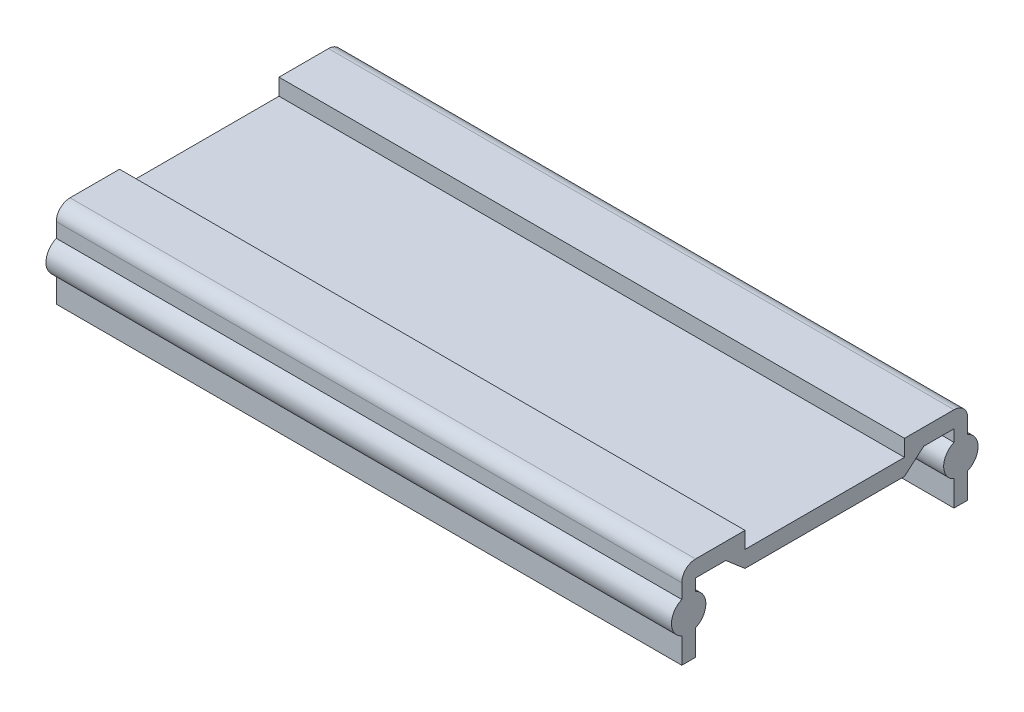
ISO-10303-21;
HEADER;
FILE_DESCRIPTION(('STEP AP214'),'2;1');
FILE_NAME('part.step','',(''),(''),'','','');
FILE_SCHEMA(('AUTOMOTIVE_DESIGN { 1 0 10303 214 1 1 1 1 }'));
ENDSEC;
DATA;
#1=APPLICATION_CONTEXT('core data for automotive mechanical design processes');
#2=APPLICATION_PROTOCOL_DEFINITION('international standard','automotive_design',2000,#1);
#3=PRODUCT_CONTEXT('',#1,'mechanical');
#4=PRODUCT('Part','Part','',(#3));
#5=PRODUCT_RELATED_PRODUCT_CATEGORY('part','',(#4));
#6=PRODUCT_DEFINITION_FORMATION('','',#4);
#7=PRODUCT_DEFINITION_CONTEXT('part definition',#1,'design');
#8=PRODUCT_DEFINITION('design','',#6,#7);
#9=PRODUCT_DEFINITION_SHAPE('','',#8);
#10=(LENGTH_UNIT() NAMED_UNIT(*) SI_UNIT(.MILLI.,.METRE.));
#11=(NAMED_UNIT(*) PLANE_ANGLE_UNIT() SI_UNIT($,.RADIAN.));
#12=(NAMED_UNIT(*) SI_UNIT($,.STERADIAN.) SOLID_ANGLE_UNIT());
#13=UNCERTAINTY_MEASURE_WITH_UNIT(LENGTH_MEASURE(1.E-05),#10,'distance_accuracy_value','');
#14=(GEOMETRIC_REPRESENTATION_CONTEXT(3) GLOBAL_UNCERTAINTY_ASSIGNED_CONTEXT((#13)) GLOBAL_UNIT_ASSIGNED_CONTEXT((#10,
#11,#12)) REPRESENTATION_CONTEXT('',''));
#15=CARTESIAN_POINT('',(0.,0.,0.));
#16=DIRECTION('',(0.,0.,1.));
#17=DIRECTION('',(1.,0.,0.));
#18=AXIS2_PLACEMENT_3D('',#15,#16,#17);
#19=CARTESIAN_POINT('',(45.5,2.2,10.4));
#20=DIRECTION('',(0.,0.,-1.));
#21=DIRECTION('',(-1.,0.,0.));
#22=AXIS2_PLACEMENT_3D('',#19,#20,#21);
#23=PLANE('',#22);
#24=DIRECTION('',(1.,0.,0.));
#25=VECTOR('',#24,1.);
#26=CARTESIAN_POINT('',(45.5,1.14564392373896,10.4));
#27=LINE('',#26,#25);
#28=CARTESIAN_POINT('',(45.5,1.14564392373896,10.4));
#29=VERTEX_POINT('',#28);
#30=CARTESIAN_POINT('',(0.,1.14564392373896,10.4));
#31=VERTEX_POINT('',#30);
#32=EDGE_CURVE('E218',#29,#31,#27,.F.);
#33=ORIENTED_EDGE('',*,*,#32,.F.);
#34=DIRECTION('',(0.,1.,0.));
#35=VECTOR('',#34,1.);
#36=CARTESIAN_POINT('',(45.5,2.2,10.4));
#37=LINE('',#36,#35);
#38=CARTESIAN_POINT('',(45.5,2.2,10.4));
#39=VERTEX_POINT('',#38);
#40=EDGE_CURVE('E314',#39,#29,#37,.F.);
#41=ORIENTED_EDGE('',*,*,#40,.F.);
#42=DIRECTION('',(1.,0.,0.));
#43=VECTOR('',#42,1.);
#44=CARTESIAN_POINT('',(45.5,2.2,10.4));
#45=LINE('',#44,#43);
#46=CARTESIAN_POINT('',(0.,2.2,10.4));
#47=VERTEX_POINT('',#46);
#48=EDGE_CURVE('E214',#47,#39,#45,.T.);
#49=ORIENTED_EDGE('',*,*,#48,.F.);
#50=DIRECTION('',(0.,1.,0.));
#51=VECTOR('',#50,1.);
#52=CARTESIAN_POINT('',(0.,2.2,10.4));
#53=LINE('',#52,#51);
#54=EDGE_CURVE('E310',#31,#47,#53,.T.);
#55=ORIENTED_EDGE('',*,*,#54,.F.);
#56=EDGE_LOOP('',(#33,#41,#49,#55));
#57=FACE_BOUND('',#56,.T.);
#58=ADVANCED_FACE('F17',(#57),#23,.F.);
#59=CARTESIAN_POINT('',(45.5,-3.,10.4));
#60=DIRECTION('',(0.,1.,0.));
#61=DIRECTION('',(0.,0.,1.));
#62=AXIS2_PLACEMENT_3D('',#59,#60,#61);
#63=PLANE('',#62);
#64=DIRECTION('',(1.,0.,0.));
#65=VECTOR('',#64,1.);
#66=CARTESIAN_POINT('',(45.5,-3.,9.4));
#67=LINE('',#66,#65);
#68=CARTESIAN_POINT('',(0.,-3.,9.4));
#69=VERTEX_POINT('',#68);
#70=CARTESIAN_POINT('',(45.5,-3.,9.4));
#71=VERTEX_POINT('',#70);
#72=EDGE_CURVE('E370',#69,#71,#67,.T.);
#73=ORIENTED_EDGE('',*,*,#72,.T.);
#74=DIRECTION('',(0.,0.,1.));
#75=VECTOR('',#74,1.);
#76=CARTESIAN_POINT('',(45.5,-3.,10.4));
#77=LINE('',#76,#75);
#78=CARTESIAN_POINT('',(45.5,-3.,10.4));
#79=VERTEX_POINT('',#78);
#80=EDGE_CURVE('E313',#79,#71,#77,.F.);
#81=ORIENTED_EDGE('',*,*,#80,.F.);
#82=DIRECTION('',(-1.,0.,0.));
#83=VECTOR('',#82,1.);
#84=CARTESIAN_POINT('',(45.5,-3.,10.4));
#85=LINE('',#84,#83);
#86=CARTESIAN_POINT('',(0.,-3.,10.4));
#87=VERTEX_POINT('',#86);
#88=EDGE_CURVE('E367',#79,#87,#85,.T.);
#89=ORIENTED_EDGE('',*,*,#88,.T.);
#90=DIRECTION('',(0.,0.,1.));
#91=VECTOR('',#90,1.);
#92=CARTESIAN_POINT('',(0.,-3.,10.4));
#93=LINE('',#92,#91);
#94=EDGE_CURVE('E319',#69,#87,#93,.T.);
#95=ORIENTED_EDGE('',*,*,#94,.F.);
#96=EDGE_LOOP('',(#73,#81,#89,#95));
#97=FACE_BOUND('',#96,.T.);
#98=ADVANCED_FACE('F505',(#97),#63,.F.);
#99=CARTESIAN_POINT('',(45.5,1.14564392373896,9.4));
#100=DIRECTION('',(0.,0.,1.));
#101=DIRECTION('',(1.,0.,0.));
#102=AXIS2_PLACEMENT_3D('',#99,#100,#101);
#103=PLANE('',#102);
#104=DIRECTION('',(1.,0.,0.));
#105=VECTOR('',#104,1.);
#106=CARTESIAN_POINT('',(45.5,2.,9.4));
#107=LINE('',#106,#105);
#108=CARTESIAN_POINT('',(0.,2.,9.4));
#109=VERTEX_POINT('',#108);
#110=CARTESIAN_POINT('',(45.5,2.,9.4));
#111=VERTEX_POINT('',#110);
#112=EDGE_CURVE('E266',#109,#111,#107,.T.);
#113=ORIENTED_EDGE('',*,*,#112,.T.);
#114=DIRECTION('',(0.,1.,0.));
#115=VECTOR('',#114,1.);
#116=CARTESIAN_POINT('',(45.5,1.14564392373896,9.4));
#117=LINE('',#116,#115);
#118=CARTESIAN_POINT('',(45.5,1.14564392373896,9.4));
#119=VERTEX_POINT('',#118);
#120=EDGE_CURVE('E323',#119,#111,#117,.T.);
#121=ORIENTED_EDGE('',*,*,#120,.F.);
#122=DIRECTION('',(1.,0.,0.));
#123=VECTOR('',#122,1.);
#124=CARTESIAN_POINT('',(45.5,1.14564392373896,9.4));
#125=LINE('',#124,#123);
#126=CARTESIAN_POINT('',(0.,1.14564392373896,9.4));
#127=VERTEX_POINT('',#126);
#128=EDGE_CURVE('E377',#127,#119,#125,.T.);
#129=ORIENTED_EDGE('',*,*,#128,.F.);
#130=DIRECTION('',(0.,1.,0.));
#131=VECTOR('',#130,1.);
#132=CARTESIAN_POINT('',(0.,1.14564392373896,9.4));
#133=LINE('',#132,#131);
#134=EDGE_CURVE('E327',#109,#127,#133,.F.);
#135=ORIENTED_EDGE('',*,*,#134,.F.);
#136=EDGE_LOOP('',(#113,#121,#129,#135));
#137=FACE_BOUND('',#136,.T.);
#138=ADVANCED_FACE('F493',(#137),#103,.F.);
#139=CARTESIAN_POINT('',(45.5,2.,-9.4));
#140=DIRECTION('',(0.,0.,-1.));
#141=DIRECTION('',(-1.,0.,0.));
#142=AXIS2_PLACEMENT_3D('',#139,#140,#141);
#143=PLANE('',#142);
#144=DIRECTION('',(1.,0.,0.));
#145=VECTOR('',#144,1.);
#146=CARTESIAN_POINT('',(45.5,1.14564392373896,-9.4));
#147=LINE('',#146,#145);
#148=CARTESIAN_POINT('',(45.5,1.14564392373896,-9.4));
#149=VERTEX_POINT('',#148);
#150=CARTESIAN_POINT('',(0.,1.14564392373896,-9.4));
#151=VERTEX_POINT('',#150);
#152=EDGE_CURVE('E282',#149,#151,#147,.F.);
#153=ORIENTED_EDGE('',*,*,#152,.F.);
#154=DIRECTION('',(0.,1.,0.));
#155=VECTOR('',#154,1.);
#156=CARTESIAN_POINT('',(45.5,2.,-9.4));
#157=LINE('',#156,#155);
#158=CARTESIAN_POINT('',(45.5,2.,-9.4));
#159=VERTEX_POINT('',#158);
#160=EDGE_CURVE('E331',#159,#149,#157,.F.);
#161=ORIENTED_EDGE('',*,*,#160,.F.);
#162=DIRECTION('',(1.,0.,0.));
#163=VECTOR('',#162,1.);
#164=CARTESIAN_POINT('',(45.5,2.,-9.4));
#165=LINE('',#164,#163);
#166=CARTESIAN_POINT('',(0.,2.,-9.4));
#167=VERTEX_POINT('',#166);
#168=EDGE_CURVE('E269',#159,#167,#165,.F.);
#169=ORIENTED_EDGE('',*,*,#168,.T.);
#170=DIRECTION('',(0.,1.,0.));
#171=VECTOR('',#170,1.);
#172=CARTESIAN_POINT('',(0.,2.,-9.4));
#173=LINE('',#172,#171);
#174=EDGE_CURVE('E334',#151,#167,#173,.T.);
#175=ORIENTED_EDGE('',*,*,#174,.F.);
#176=EDGE_LOOP('',(#153,#161,#169,#175));
#177=FACE_BOUND('',#176,.T.);
#178=ADVANCED_FACE('F561',(#177),#143,.F.);
#179=CARTESIAN_POINT('',(45.5,-3.,-9.4));
#180=DIRECTION('',(0.,1.,0.));
#181=DIRECTION('',(0.,0.,1.));
#182=AXIS2_PLACEMENT_3D('',#179,#180,#181);
#183=PLANE('',#182);
#184=DIRECTION('',(1.,0.,0.));
#185=VECTOR('',#184,1.);
#186=CARTESIAN_POINT('',(45.5,-3.,-10.4));
#187=LINE('',#186,#185);
#188=CARTESIAN_POINT('',(0.,-3.,-10.4));
#189=VERTEX_POINT('',#188);
#190=CARTESIAN_POINT('',(45.5,-3.,-10.4));
#191=VERTEX_POINT('',#190);
#192=EDGE_CURVE('E389',#189,#191,#187,.T.);
#193=ORIENTED_EDGE('',*,*,#192,.T.);
#194=DIRECTION('',(0.,0.,1.));
#195=VECTOR('',#194,1.);
#196=CARTESIAN_POINT('',(45.5,-3.,-9.4));
#197=LINE('',#196,#195);
#198=CARTESIAN_POINT('',(45.5,-3.,-9.4));
#199=VERTEX_POINT('',#198);
#200=EDGE_CURVE('E336',#199,#191,#197,.F.);
#201=ORIENTED_EDGE('',*,*,#200,.F.);
#202=DIRECTION('',(-1.,0.,0.));
#203=VECTOR('',#202,1.);
#204=CARTESIAN_POINT('',(45.5,-3.,-9.4));
#205=LINE('',#204,#203);
#206=CARTESIAN_POINT('',(0.,-3.,-9.4));
#207=VERTEX_POINT('',#206);
#208=EDGE_CURVE('E386',#199,#207,#205,.T.);
#209=ORIENTED_EDGE('',*,*,#208,.T.);
#210=DIRECTION('',(0.,0.,1.));
#211=VECTOR('',#210,1.);
#212=CARTESIAN_POINT('',(0.,-3.,-9.4));
#213=LINE('',#212,#211);
#214=EDGE_CURVE('E343',#189,#207,#213,.T.);
#215=ORIENTED_EDGE('',*,*,#214,.F.);
#216=EDGE_LOOP('',(#193,#201,#209,#215));
#217=FACE_BOUND('',#216,.T.);
#218=ADVANCED_FACE('F550',(#217),#183,.F.);
#219=CARTESIAN_POINT('',(45.5,1.14564392373896,-10.4));
#220=DIRECTION('',(0.,0.,1.));
#221=DIRECTION('',(1.,0.,0.));
#222=AXIS2_PLACEMENT_3D('',#219,#220,#221);
#223=PLANE('',#222);
#224=DIRECTION('',(1.,0.,0.));
#225=VECTOR('',#224,1.);
#226=CARTESIAN_POINT('',(45.5,2.2,-10.4));
#227=LINE('',#226,#225);
#228=CARTESIAN_POINT('',(45.5,2.2,-10.4));
#229=VERTEX_POINT('',#228);
#230=CARTESIAN_POINT('',(0.,2.2,-10.4));
#231=VERTEX_POINT('',#230);
#232=EDGE_CURVE('E190',#229,#231,#227,.F.);
#233=ORIENTED_EDGE('',*,*,#232,.F.);
#234=DIRECTION('',(0.,1.,0.));
#235=VECTOR('',#234,1.);
#236=CARTESIAN_POINT('',(45.5,1.14564392373896,-10.4));
#237=LINE('',#236,#235);
#238=CARTESIAN_POINT('',(45.5,1.14564392373896,-10.4));
#239=VERTEX_POINT('',#238);
#240=EDGE_CURVE('E196',#239,#229,#237,.T.);
#241=ORIENTED_EDGE('',*,*,#240,.F.);
#242=DIRECTION('',(1.,0.,0.));
#243=VECTOR('',#242,1.);
#244=CARTESIAN_POINT('',(45.5,1.14564392373896,-10.4));
#245=LINE('',#244,#243);
#246=CARTESIAN_POINT('',(0.,1.14564392373896,-10.4));
#247=VERTEX_POINT('',#246);
#248=EDGE_CURVE('E192',#247,#239,#245,.T.);
#249=ORIENTED_EDGE('',*,*,#248,.F.);
#250=DIRECTION('',(0.,1.,0.));
#251=VECTOR('',#250,1.);
#252=CARTESIAN_POINT('',(0.,1.14564392373896,-10.4));
#253=LINE('',#252,#251);
#254=EDGE_CURVE('E187',#231,#247,#253,.F.);
#255=ORIENTED_EDGE('',*,*,#254,.F.);
#256=EDGE_LOOP('',(#233,#241,#249,#255));
#257=FACE_BOUND('',#256,.T.);
#258=ADVANCED_FACE('F189',(#257),#223,.F.);
#259=CARTESIAN_POINT('',(45.5,2.2,-9.4));
#260=DIRECTION('',(1.,0.,0.));
#261=DIRECTION('',(0.,0.,-1.));
#262=AXIS2_PLACEMENT_3D('',#259,#260,#261);
#263=CYLINDRICAL_SURFACE('',#262,0.999999999999999);
#264=CARTESIAN_POINT('',(45.5,2.2,-9.4));
#265=DIRECTION('',(1.,0.,0.));
#266=DIRECTION('',(0.,0.,-1.));
#267=AXIS2_PLACEMENT_3D('',#264,#265,#266);
#268=CIRCLE('',#267,0.999999999999999);
#269=CARTESIAN_POINT('',(45.5,3.2,-9.4));
#270=VERTEX_POINT('',#269);
#271=EDGE_CURVE('E203',#270,#229,#268,.F.);
#272=ORIENTED_EDGE('',*,*,#271,.T.);
#273=ORIENTED_EDGE('',*,*,#232,.T.);
#274=CARTESIAN_POINT('',(0.,2.2,-9.4));
#275=DIRECTION('',(1.,0.,0.));
#276=DIRECTION('',(0.,0.,-1.));
#277=AXIS2_PLACEMENT_3D('',#274,#275,#276);
#278=CIRCLE('',#277,0.999999999999999);
#279=CARTESIAN_POINT('',(0.,3.2,-9.4));
#280=VERTEX_POINT('',#279);
#281=EDGE_CURVE('E20',#231,#280,#278,.T.);
#282=ORIENTED_EDGE('',*,*,#281,.T.);
#283=DIRECTION('',(1.,0.,0.));
#284=VECTOR('',#283,1.);
#285=CARTESIAN_POINT('',(45.5,3.2,-9.4));
#286=LINE('',#285,#284);
#287=EDGE_CURVE('E399',#280,#270,#286,.T.);
#288=ORIENTED_EDGE('',*,*,#287,.T.);
#289=EDGE_LOOP('',(#272,#273,#282,#288));
#290=FACE_BOUND('',#289,.T.);
#291=ADVANCED_FACE('F200',(#290),#263,.T.);
#292=CARTESIAN_POINT('',(45.5,3.2,-5.8));
#293=DIRECTION('',(0.,0.,-1.));
#294=DIRECTION('',(0.,1.,0.));
#295=AXIS2_PLACEMENT_3D('',#292,#293,#294);
#296=PLANE('',#295);
#297=DIRECTION('',(1.,0.,0.));
#298=VECTOR('',#297,1.);
#299=CARTESIAN_POINT('',(45.5,2.,-5.8));
#300=LINE('',#299,#298);
#301=CARTESIAN_POINT('',(0.,2.,-5.8));
#302=VERTEX_POINT('',#301);
#303=CARTESIAN_POINT('',(45.5,2.,-5.8));
#304=VERTEX_POINT('',#303);
#305=EDGE_CURVE('E286',#302,#304,#300,.T.);
#306=ORIENTED_EDGE('',*,*,#305,.T.);
#307=DIRECTION('',(0.,1.,0.));
#308=VECTOR('',#307,1.);
#309=CARTESIAN_POINT('',(45.5,3.2,-5.8));
#310=LINE('',#309,#308);
#311=CARTESIAN_POINT('',(45.5,3.2,-5.8));
#312=VERTEX_POINT('',#311);
#313=EDGE_CURVE('E205',#312,#304,#310,.F.);
#314=ORIENTED_EDGE('',*,*,#313,.F.);
#315=DIRECTION('',(1.,0.,0.));
#316=VECTOR('',#315,1.);
#317=CARTESIAN_POINT('',(45.5,3.2,-5.8));
#318=LINE('',#317,#316);
#319=CARTESIAN_POINT('',(0.,3.2,-5.8));
#320=VERTEX_POINT('',#319);
#321=EDGE_CURVE('E290',#312,#320,#318,.F.);
#322=ORIENTED_EDGE('',*,*,#321,.T.);
#323=DIRECTION('',(0.,1.,0.));
#324=VECTOR('',#323,1.);
#325=CARTESIAN_POINT('',(0.,3.2,-5.8));
#326=LINE('',#325,#324);
#327=EDGE_CURVE('E350',#302,#320,#326,.T.);
#328=ORIENTED_EDGE('',*,*,#327,.F.);
#329=EDGE_LOOP('',(#306,#314,#322,#328));
#330=FACE_BOUND('',#329,.T.);
#331=ADVANCED_FACE('F535',(#330),#296,.F.);
#332=CARTESIAN_POINT('',(45.5,2.,5.8));
#333=DIRECTION('',(0.,0.,1.));
#334=DIRECTION('',(0.,-1.,0.));
#335=AXIS2_PLACEMENT_3D('',#332,#333,#334);
#336=PLANE('',#335);
#337=DIRECTION('',(1.,0.,0.));
#338=VECTOR('',#337,1.);
#339=CARTESIAN_POINT('',(45.5,3.2,5.8));
#340=LINE('',#339,#338);
#341=CARTESIAN_POINT('',(0.,3.2,5.8));
#342=VERTEX_POINT('',#341);
#343=CARTESIAN_POINT('',(45.5,3.2,5.8));
#344=VERTEX_POINT('',#343);
#345=EDGE_CURVE('E307',#342,#344,#340,.T.);
#346=ORIENTED_EDGE('',*,*,#345,.T.);
#347=DIRECTION('',(0.,-1.,0.));
#348=VECTOR('',#347,1.);
#349=CARTESIAN_POINT('',(45.5,2.,5.8));
#350=LINE('',#349,#348);
#351=CARTESIAN_POINT('',(45.5,2.,5.8));
#352=VERTEX_POINT('',#351);
#353=EDGE_CURVE('E352',#352,#344,#350,.F.);
#354=ORIENTED_EDGE('',*,*,#353,.F.);
#355=DIRECTION('',(1.,0.,0.));
#356=VECTOR('',#355,1.);
#357=CARTESIAN_POINT('',(45.5,2.,5.8));
#358=LINE('',#357,#356);
#359=CARTESIAN_POINT('',(0.,2.,5.8));
#360=VERTEX_POINT('',#359);
#361=EDGE_CURVE('E289',#352,#360,#358,.F.);
#362=ORIENTED_EDGE('',*,*,#361,.T.);
#363=DIRECTION('',(0.,-1.,0.));
#364=VECTOR('',#363,1.);
#365=CARTESIAN_POINT('',(0.,2.,5.8));
#366=LINE('',#365,#364);
#367=EDGE_CURVE('E215',#342,#360,#366,.T.);
#368=ORIENTED_EDGE('',*,*,#367,.F.);
#369=EDGE_LOOP('',(#346,#354,#362,#368));
#370=FACE_BOUND('',#369,.T.);
#371=ADVANCED_FACE('F527',(#370),#336,.F.);
#372=CARTESIAN_POINT('',(45.5,2.2,9.4));
#373=DIRECTION('',(1.,0.,0.));
#374=DIRECTION('',(0.,0.,-1.));
#375=AXIS2_PLACEMENT_3D('',#372,#373,#374);
#376=CYLINDRICAL_SURFACE('',#375,0.999999999999999);
#377=CARTESIAN_POINT('',(45.5,2.2,9.4));
#378=DIRECTION('',(1.,0.,0.));
#379=DIRECTION('',(0.,0.,-1.));
#380=AXIS2_PLACEMENT_3D('',#377,#378,#379);
#381=CIRCLE('',#380,0.999999999999999);
#382=CARTESIAN_POINT('',(45.5,3.2,9.4));
#383=VERTEX_POINT('',#382);
#384=EDGE_CURVE('E216',#39,#383,#381,.F.);
#385=ORIENTED_EDGE('',*,*,#384,.T.);
#386=DIRECTION('',(1.,0.,0.));
#387=VECTOR('',#386,1.);
#388=CARTESIAN_POINT('',(45.5,3.2,9.4));
#389=LINE('',#388,#387);
#390=CARTESIAN_POINT('',(0.,3.2,9.4));
#391=VERTEX_POINT('',#390);
#392=EDGE_CURVE('E409',#383,#391,#389,.F.);
#393=ORIENTED_EDGE('',*,*,#392,.T.);
#394=CARTESIAN_POINT('',(0.,2.2,9.4));
#395=DIRECTION('',(1.,0.,0.));
#396=DIRECTION('',(0.,0.,-1.));
#397=AXIS2_PLACEMENT_3D('',#394,#395,#396);
#398=CIRCLE('',#397,0.999999999999999);
#399=EDGE_CURVE('E212',#391,#47,#398,.T.);
#400=ORIENTED_EDGE('',*,*,#399,.T.);
#401=ORIENTED_EDGE('',*,*,#48,.T.);
#402=EDGE_LOOP('',(#385,#393,#400,#401));
#403=FACE_BOUND('',#402,.T.);
#404=ADVANCED_FACE('F520',(#403),#376,.T.);
#405=CARTESIAN_POINT('',(45.5,0.,9.9));
#406=DIRECTION('',(1.,0.,0.));
#407=DIRECTION('',(0.,0.,-1.));
#408=AXIS2_PLACEMENT_3D('',#405,#406,#407);
#409=CYLINDRICAL_SURFACE('',#408,1.25);
#410=CARTESIAN_POINT('',(45.5,0.,9.9));
#411=DIRECTION('',(1.,0.,0.));
#412=DIRECTION('',(0.,0.,-1.));
#413=AXIS2_PLACEMENT_3D('',#410,#411,#412);
#414=CIRCLE('',#413,1.25);
#415=CARTESIAN_POINT('',(45.5,-1.14564392373896,10.4));
#416=VERTEX_POINT('',#415);
#417=EDGE_CURVE('E219',#29,#416,#414,.T.);
#418=ORIENTED_EDGE('',*,*,#417,.F.);
#419=ORIENTED_EDGE('',*,*,#32,.T.);
#420=CARTESIAN_POINT('',(0.,0.,9.9));
#421=DIRECTION('',(1.,0.,0.));
#422=DIRECTION('',(0.,0.,-1.));
#423=AXIS2_PLACEMENT_3D('',#420,#421,#422);
#424=CIRCLE('',#423,1.25);
#425=CARTESIAN_POINT('',(0.,-1.14564392373896,10.4));
#426=VERTEX_POINT('',#425);
#427=EDGE_CURVE('E237',#31,#426,#424,.T.);
#428=ORIENTED_EDGE('',*,*,#427,.T.);
#429=DIRECTION('',(-1.,0.,0.));
#430=VECTOR('',#429,1.);
#431=CARTESIAN_POINT('',(45.5,-1.14564392373896,10.4));
#432=LINE('',#431,#430);
#433=EDGE_CURVE('E364',#426,#416,#432,.F.);
#434=ORIENTED_EDGE('',*,*,#433,.T.);
#435=EDGE_LOOP('',(#418,#419,#428,#434));
#436=FACE_BOUND('',#435,.T.);
#437=ADVANCED_FACE('F512',(#436),#409,.T.);
#438=CARTESIAN_POINT('',(45.5,-1.14564392373896,10.4));
#439=DIRECTION('',(0.,0.,-1.));
#440=DIRECTION('',(-1.,0.,0.));
#441=AXIS2_PLACEMENT_3D('',#438,#439,#440);
#442=PLANE('',#441);
#443=ORIENTED_EDGE('',*,*,#88,.F.);
#444=DIRECTION('',(0.,1.,0.));
#445=VECTOR('',#444,1.);
#446=CARTESIAN_POINT('',(45.5,0.,10.4));
#447=LINE('',#446,#445);
#448=EDGE_CURVE('E221',#416,#79,#447,.F.);
#449=ORIENTED_EDGE('',*,*,#448,.F.);
#450=ORIENTED_EDGE('',*,*,#433,.F.);
#451=DIRECTION('',(0.,1.,0.));
#452=VECTOR('',#451,1.);
#453=CARTESIAN_POINT('',(0.,0.,10.4));
#454=LINE('',#453,#452);
#455=EDGE_CURVE('E240',#426,#87,#454,.F.);
#456=ORIENTED_EDGE('',*,*,#455,.T.);
#457=EDGE_LOOP('',(#443,#449,#450,#456));
#458=FACE_BOUND('',#457,.T.);
#459=ADVANCED_FACE('F697',(#458),#442,.F.);
#460=CARTESIAN_POINT('',(45.5,-3.,9.4));
#461=DIRECTION('',(0.,0.,1.));
#462=DIRECTION('',(1.,0.,0.));
#463=AXIS2_PLACEMENT_3D('',#460,#461,#462);
#464=PLANE('',#463);
#465=DIRECTION('',(1.,0.,0.));
#466=VECTOR('',#465,1.);
#467=CARTESIAN_POINT('',(45.5,-1.14564392373896,9.4));
#468=LINE('',#467,#466);
#469=CARTESIAN_POINT('',(45.5,-1.14564392373896,9.4));
#470=VERTEX_POINT('',#469);
#471=CARTESIAN_POINT('',(0.,-1.14564392373896,9.4));
#472=VERTEX_POINT('',#471);
#473=EDGE_CURVE('E270',#470,#472,#468,.F.);
#474=ORIENTED_EDGE('',*,*,#473,.F.);
#475=DIRECTION('',(0.,1.,0.));
#476=VECTOR('',#475,1.);
#477=CARTESIAN_POINT('',(45.5,0.,9.4));
#478=LINE('',#477,#476);
#479=EDGE_CURVE('E227',#71,#470,#478,.T.);
#480=ORIENTED_EDGE('',*,*,#479,.F.);
#481=ORIENTED_EDGE('',*,*,#72,.F.);
#482=DIRECTION('',(0.,1.,0.));
#483=VECTOR('',#482,1.);
#484=CARTESIAN_POINT('',(0.,0.,9.4));
#485=LINE('',#484,#483);
#486=EDGE_CURVE('E246',#69,#472,#485,.T.);
#487=ORIENTED_EDGE('',*,*,#486,.T.);
#488=EDGE_LOOP('',(#474,#480,#481,#487));
#489=FACE_BOUND('',#488,.T.);
#490=ADVANCED_FACE('F501',(#489),#464,.F.);
#491=CARTESIAN_POINT('',(45.5,0.,9.9));
#492=DIRECTION('',(1.,0.,0.));
#493=DIRECTION('',(0.,0.,-1.));
#494=AXIS2_PLACEMENT_3D('',#491,#492,#493);
#495=CYLINDRICAL_SURFACE('',#494,1.25);
#496=CARTESIAN_POINT('',(45.5,0.,9.9));
#497=DIRECTION('',(1.,0.,0.));
#498=DIRECTION('',(0.,0.,-1.));
#499=AXIS2_PLACEMENT_3D('',#496,#497,#498);
#500=CIRCLE('',#499,1.25);
#501=EDGE_CURVE('E223',#470,#119,#500,.T.);
#502=ORIENTED_EDGE('',*,*,#501,.F.);
#503=ORIENTED_EDGE('',*,*,#473,.T.);
#504=CARTESIAN_POINT('',(0.,0.,9.9));
#505=DIRECTION('',(1.,0.,0.));
#506=DIRECTION('',(0.,0.,-1.));
#507=AXIS2_PLACEMENT_3D('',#504,#505,#506);
#508=CIRCLE('',#507,1.25);
#509=EDGE_CURVE('E242',#472,#127,#508,.T.);
#510=ORIENTED_EDGE('',*,*,#509,.T.);
#511=ORIENTED_EDGE('',*,*,#128,.T.);
#512=EDGE_LOOP('',(#502,#503,#510,#511));
#513=FACE_BOUND('',#512,.T.);
#514=ADVANCED_FACE('F682',(#513),#495,.T.);
#515=CARTESIAN_POINT('',(45.5,2.,9.4));
#516=DIRECTION('',(0.,1.,0.));
#517=DIRECTION('',(0.,0.,1.));
#518=AXIS2_PLACEMENT_3D('',#515,#516,#517);
#519=PLANE('',#518);
#520=DIRECTION('',(1.,0.,0.));
#521=VECTOR('',#520,1.);
#522=CARTESIAN_POINT('',(45.5,2.,7.2));
#523=LINE('',#522,#521);
#524=CARTESIAN_POINT('',(0.,2.,7.2));
#525=VERTEX_POINT('',#524);
#526=CARTESIAN_POINT('',(45.5,2.,7.2));
#527=VERTEX_POINT('',#526);
#528=EDGE_CURVE('E222',#525,#527,#523,.T.);
#529=ORIENTED_EDGE('',*,*,#528,.T.);
#530=DIRECTION('',(0.,0.,-1.));
#531=VECTOR('',#530,1.);
#532=CARTESIAN_POINT('',(45.5,2.,9.9));
#533=LINE('',#532,#531);
#534=EDGE_CURVE('E226',#111,#527,#533,.T.);
#535=ORIENTED_EDGE('',*,*,#534,.F.);
#536=ORIENTED_EDGE('',*,*,#112,.F.);
#537=DIRECTION('',(0.,0.,-1.));
#538=VECTOR('',#537,1.);
#539=CARTESIAN_POINT('',(0.,2.,9.9));
#540=LINE('',#539,#538);
#541=EDGE_CURVE('E245',#109,#525,#540,.T.);
#542=ORIENTED_EDGE('',*,*,#541,.T.);
#543=EDGE_LOOP('',(#529,#535,#536,#542));
#544=FACE_BOUND('',#543,.T.);
#545=ADVANCED_FACE('F491',(#544),#519,.F.);
#546=CARTESIAN_POINT('',(45.5,2.,-7.2));
#547=DIRECTION('',(0.,1.,0.));
#548=DIRECTION('',(0.,0.,1.));
#549=AXIS2_PLACEMENT_3D('',#546,#547,#548);
#550=PLANE('',#549);
#551=ORIENTED_EDGE('',*,*,#168,.F.);
#552=DIRECTION('',(0.,0.,-1.));
#553=VECTOR('',#552,1.);
#554=CARTESIAN_POINT('',(45.5,2.,9.9));
#555=LINE('',#554,#553);
#556=CARTESIAN_POINT('',(45.5,2.,-7.2));
#557=VERTEX_POINT('',#556);
#558=EDGE_CURVE('E231',#557,#159,#555,.T.);
#559=ORIENTED_EDGE('',*,*,#558,.F.);
#560=DIRECTION('',(1.,0.,0.));
#561=VECTOR('',#560,1.);
#562=CARTESIAN_POINT('',(45.5,2.,-7.2));
#563=LINE('',#562,#561);
#564=CARTESIAN_POINT('',(0.,2.,-7.2));
#565=VERTEX_POINT('',#564);
#566=EDGE_CURVE('E241',#557,#565,#563,.F.);
#567=ORIENTED_EDGE('',*,*,#566,.T.);
#568=DIRECTION('',(0.,0.,-1.));
#569=VECTOR('',#568,1.);
#570=CARTESIAN_POINT('',(0.,2.,9.9));
#571=LINE('',#570,#569);
#572=EDGE_CURVE('E251',#565,#167,#571,.T.);
#573=ORIENTED_EDGE('',*,*,#572,.T.);
#574=EDGE_LOOP('',(#551,#559,#567,#573));
#575=FACE_BOUND('',#574,.T.);
#576=ADVANCED_FACE('F564',(#575),#550,.F.);
#577=CARTESIAN_POINT('',(45.5,0.,-9.9));
#578=DIRECTION('',(1.,0.,0.));
#579=DIRECTION('',(0.,0.,-1.));
#580=AXIS2_PLACEMENT_3D('',#577,#578,#579);
#581=CYLINDRICAL_SURFACE('',#580,1.25);
#582=CARTESIAN_POINT('',(45.5,0.,-9.9));
#583=DIRECTION('',(1.,0.,0.));
#584=DIRECTION('',(0.,0.,-1.));
#585=AXIS2_PLACEMENT_3D('',#582,#583,#584);
#586=CIRCLE('',#585,1.25);
#587=CARTESIAN_POINT('',(45.5,-1.14564392373896,-9.4));
#588=VERTEX_POINT('',#587);
#589=EDGE_CURVE('E228',#149,#588,#586,.T.);
#590=ORIENTED_EDGE('',*,*,#589,.F.);
#591=ORIENTED_EDGE('',*,*,#152,.T.);
#592=CARTESIAN_POINT('',(0.,0.,-9.9));
#593=DIRECTION('',(1.,0.,0.));
#594=DIRECTION('',(0.,0.,-1.));
#595=AXIS2_PLACEMENT_3D('',#592,#593,#594);
#596=CIRCLE('',#595,1.25);
#597=CARTESIAN_POINT('',(0.,-1.14564392373896,-9.4));
#598=VERTEX_POINT('',#597);
#599=EDGE_CURVE('E247',#151,#598,#596,.T.);
#600=ORIENTED_EDGE('',*,*,#599,.T.);
#601=DIRECTION('',(-1.,0.,0.));
#602=VECTOR('',#601,1.);
#603=CARTESIAN_POINT('',(45.5,-1.14564392373896,-9.4));
#604=LINE('',#603,#602);
#605=EDGE_CURVE('E383',#598,#588,#604,.F.);
#606=ORIENTED_EDGE('',*,*,#605,.T.);
#607=EDGE_LOOP('',(#590,#591,#600,#606));
#608=FACE_BOUND('',#607,.T.);
#609=ADVANCED_FACE('F557',(#608),#581,.T.);
#610=CARTESIAN_POINT('',(45.5,-1.14564392373896,-9.4));
#611=DIRECTION('',(0.,0.,-1.));
#612=DIRECTION('',(-1.,0.,0.));
#613=AXIS2_PLACEMENT_3D('',#610,#611,#612);
#614=PLANE('',#613);
#615=ORIENTED_EDGE('',*,*,#208,.F.);
#616=DIRECTION('',(0.,1.,0.));
#617=VECTOR('',#616,1.);
#618=CARTESIAN_POINT('',(45.5,0.,-9.4));
#619=LINE('',#618,#617);
#620=EDGE_CURVE('E230',#588,#199,#619,.F.);
#621=ORIENTED_EDGE('',*,*,#620,.F.);
#622=ORIENTED_EDGE('',*,*,#605,.F.);
#623=DIRECTION('',(0.,1.,0.));
#624=VECTOR('',#623,1.);
#625=CARTESIAN_POINT('',(0.,0.,-9.4));
#626=LINE('',#625,#624);
#627=EDGE_CURVE('E250',#598,#207,#626,.F.);
#628=ORIENTED_EDGE('',*,*,#627,.T.);
#629=EDGE_LOOP('',(#615,#621,#622,#628));
#630=FACE_BOUND('',#629,.T.);
#631=ADVANCED_FACE('F565',(#630),#614,.F.);
#632=CARTESIAN_POINT('',(45.5,-3.,-10.4));
#633=DIRECTION('',(0.,0.,1.));
#634=DIRECTION('',(1.,0.,0.));
#635=AXIS2_PLACEMENT_3D('',#632,#633,#634);
#636=PLANE('',#635);
#637=DIRECTION('',(1.,0.,0.));
#638=VECTOR('',#637,1.);
#639=CARTESIAN_POINT('',(45.5,-1.14564392373896,-10.4));
#640=LINE('',#639,#638);
#641=CARTESIAN_POINT('',(45.5,-1.14564392373896,-10.4));
#642=VERTEX_POINT('',#641);
#643=CARTESIAN_POINT('',(0.,-1.14564392373896,-10.4));
#644=VERTEX_POINT('',#643);
#645=EDGE_CURVE('E397',#642,#644,#640,.F.);
#646=ORIENTED_EDGE('',*,*,#645,.F.);
#647=DIRECTION('',(0.,1.,0.));
#648=VECTOR('',#647,1.);
#649=CARTESIAN_POINT('',(45.5,0.,-10.4));
#650=LINE('',#649,#648);
#651=EDGE_CURVE('E236',#191,#642,#650,.T.);
#652=ORIENTED_EDGE('',*,*,#651,.F.);
#653=ORIENTED_EDGE('',*,*,#192,.F.);
#654=DIRECTION('',(0.,1.,0.));
#655=VECTOR('',#654,1.);
#656=CARTESIAN_POINT('',(0.,0.,-10.4));
#657=LINE('',#656,#655);
#658=EDGE_CURVE('E254',#189,#644,#657,.T.);
#659=ORIENTED_EDGE('',*,*,#658,.T.);
#660=EDGE_LOOP('',(#646,#652,#653,#659));
#661=FACE_BOUND('',#660,.T.);
#662=ADVANCED_FACE('F547',(#661),#636,.F.);
#663=CARTESIAN_POINT('',(45.5,0.,-9.9));
#664=DIRECTION('',(1.,0.,0.));
#665=DIRECTION('',(0.,0.,-1.));
#666=AXIS2_PLACEMENT_3D('',#663,#664,#665);
#667=CYLINDRICAL_SURFACE('',#666,1.25);
#668=CARTESIAN_POINT('',(45.5,0.,-9.9));
#669=DIRECTION('',(1.,0.,0.));
#670=DIRECTION('',(0.,0.,-1.));
#671=AXIS2_PLACEMENT_3D('',#668,#669,#670);
#672=CIRCLE('',#671,1.25);
#673=EDGE_CURVE('E232',#642,#239,#672,.T.);
#674=ORIENTED_EDGE('',*,*,#673,.F.);
#675=ORIENTED_EDGE('',*,*,#645,.T.);
#676=CARTESIAN_POINT('',(0.,0.,-9.9));
#677=DIRECTION('',(1.,0.,0.));
#678=DIRECTION('',(0.,0.,-1.));
#679=AXIS2_PLACEMENT_3D('',#676,#677,#678);
#680=CIRCLE('',#679,1.25);
#681=EDGE_CURVE('E252',#644,#247,#680,.T.);
#682=ORIENTED_EDGE('',*,*,#681,.T.);
#683=ORIENTED_EDGE('',*,*,#248,.T.);
#684=EDGE_LOOP('',(#674,#675,#682,#683));
#685=FACE_BOUND('',#684,.T.);
#686=ADVANCED_FACE('F542',(#685),#667,.T.);
#687=CARTESIAN_POINT('',(45.5,3.2,-9.4));
#688=DIRECTION('',(0.,-1.,0.));
#689=DIRECTION('',(0.,0.,-1.));
#690=AXIS2_PLACEMENT_3D('',#687,#688,#689);
#691=PLANE('',#690);
#692=ORIENTED_EDGE('',*,*,#321,.F.);
#693=DIRECTION('',(0.,0.,-1.));
#694=VECTOR('',#693,1.);
#695=CARTESIAN_POINT('',(45.5,3.2,9.9));
#696=LINE('',#695,#694);
#697=EDGE_CURVE('E235',#270,#312,#696,.F.);
#698=ORIENTED_EDGE('',*,*,#697,.F.);
#699=ORIENTED_EDGE('',*,*,#287,.F.);
#700=DIRECTION('',(0.,0.,-1.));
#701=VECTOR('',#700,1.);
#702=CARTESIAN_POINT('',(0.,3.2,9.9));
#703=LINE('',#702,#701);
#704=EDGE_CURVE('E210',#280,#320,#703,.F.);
#705=ORIENTED_EDGE('',*,*,#704,.T.);
#706=EDGE_LOOP('',(#692,#698,#699,#705));
#707=FACE_BOUND('',#706,.T.);
#708=ADVANCED_FACE('F539',(#707),#691,.F.);
#709=CARTESIAN_POINT('',(45.5,2.,-5.8));
#710=DIRECTION('',(0.,-1.,0.));
#711=DIRECTION('',(0.,0.,-1.));
#712=AXIS2_PLACEMENT_3D('',#709,#710,#711);
#713=PLANE('',#712);
#714=ORIENTED_EDGE('',*,*,#361,.F.);
#715=DIRECTION('',(0.,0.,-1.));
#716=VECTOR('',#715,1.);
#717=CARTESIAN_POINT('',(45.5,2.,9.9));
#718=LINE('',#717,#716);
#719=EDGE_CURVE('E293',#304,#352,#718,.F.);
#720=ORIENTED_EDGE('',*,*,#719,.F.);
#721=ORIENTED_EDGE('',*,*,#305,.F.);
#722=DIRECTION('',(0.,0.,-1.));
#723=VECTOR('',#722,1.);
#724=CARTESIAN_POINT('',(0.,2.,9.9));
#725=LINE('',#724,#723);
#726=EDGE_CURVE('E299',#302,#360,#725,.F.);
#727=ORIENTED_EDGE('',*,*,#726,.T.);
#728=EDGE_LOOP('',(#714,#720,#721,#727));
#729=FACE_BOUND('',#728,.T.);
#730=ADVANCED_FACE('F532',(#729),#713,.F.);
#731=CARTESIAN_POINT('',(45.5,3.2,5.8));
#732=DIRECTION('',(0.,-1.,0.));
#733=DIRECTION('',(0.,0.,-1.));
#734=AXIS2_PLACEMENT_3D('',#731,#732,#733);
#735=PLANE('',#734);
#736=ORIENTED_EDGE('',*,*,#392,.F.);
#737=DIRECTION('',(0.,0.,-1.));
#738=VECTOR('',#737,1.);
#739=CARTESIAN_POINT('',(45.5,3.2,9.9));
#740=LINE('',#739,#738);
#741=EDGE_CURVE('E296',#344,#383,#740,.F.);
#742=ORIENTED_EDGE('',*,*,#741,.F.);
#743=ORIENTED_EDGE('',*,*,#345,.F.);
#744=DIRECTION('',(0.,0.,-1.));
#745=VECTOR('',#744,1.);
#746=CARTESIAN_POINT('',(0.,3.2,9.9));
#747=LINE('',#746,#745);
#748=EDGE_CURVE('E302',#342,#391,#747,.F.);
#749=ORIENTED_EDGE('',*,*,#748,.T.);
#750=EDGE_LOOP('',(#736,#742,#743,#749));
#751=FACE_BOUND('',#750,.T.);
#752=ADVANCED_FACE('F525',(#751),#735,.F.);
#753=CARTESIAN_POINT('',(45.5,2.,7.2));
#754=DIRECTION('',(0.,0.759256602365297,-0.650791373455968));
#755=DIRECTION('',(0.,0.650791373455968,0.759256602365297));
#756=AXIS2_PLACEMENT_3D('',#753,#754,#755);
#757=PLANE('',#756);
#758=DIRECTION('',(1.,0.,0.));
#759=VECTOR('',#758,1.);
#760=CARTESIAN_POINT('',(45.5,0.8,5.8));
#761=LINE('',#760,#759);
#762=CARTESIAN_POINT('',(0.,0.8,5.8));
#763=VERTEX_POINT('',#762);
#764=CARTESIAN_POINT('',(45.5,0.8,5.8));
#765=VERTEX_POINT('',#764);
#766=EDGE_CURVE('E467',#763,#765,#761,.T.);
#767=ORIENTED_EDGE('',*,*,#766,.T.);
#768=DIRECTION('',(0.,-0.650791373455968,-0.759256602365297));
#769=VECTOR('',#768,1.);
#770=CARTESIAN_POINT('',(45.5,2.,7.2));
#771=LINE('',#770,#769);
#772=EDGE_CURVE('E258',#527,#765,#771,.T.);
#773=ORIENTED_EDGE('',*,*,#772,.F.);
#774=ORIENTED_EDGE('',*,*,#528,.F.);
#775=DIRECTION('',(0.,-0.650791373455968,-0.759256602365297));
#776=VECTOR('',#775,1.);
#777=CARTESIAN_POINT('',(0.,2.,7.2));
#778=LINE('',#777,#776);
#779=EDGE_CURVE('E263',#525,#763,#778,.T.);
#780=ORIENTED_EDGE('',*,*,#779,.T.);
#781=EDGE_LOOP('',(#767,#773,#774,#780));
#782=FACE_BOUND('',#781,.T.);
#783=ADVANCED_FACE('F486',(#782),#757,.F.);
#784=CARTESIAN_POINT('',(45.5,0.,9.9));
#785=DIRECTION('',(1.,0.,0.));
#786=DIRECTION('',(0.,0.,-1.));
#787=AXIS2_PLACEMENT_3D('',#784,#785,#786);
#788=PLANE('',#787);
#789=ORIENTED_EDGE('',*,*,#741,.T.);
#790=ORIENTED_EDGE('',*,*,#384,.F.);
#791=ORIENTED_EDGE('',*,*,#40,.T.);
#792=ORIENTED_EDGE('',*,*,#417,.T.);
#793=ORIENTED_EDGE('',*,*,#448,.T.);
#794=ORIENTED_EDGE('',*,*,#80,.T.);
#795=ORIENTED_EDGE('',*,*,#479,.T.);
#796=ORIENTED_EDGE('',*,*,#501,.T.);
#797=ORIENTED_EDGE('',*,*,#120,.T.);
#798=ORIENTED_EDGE('',*,*,#534,.T.);
#799=ORIENTED_EDGE('',*,*,#772,.T.);
#800=DIRECTION('',(0.,0.,1.));
#801=VECTOR('',#800,1.);
#802=CARTESIAN_POINT('',(45.5,0.8,5.8));
#803=LINE('',#802,#801);
#804=CARTESIAN_POINT('',(45.5,0.8,-5.8));
#805=VERTEX_POINT('',#804);
#806=EDGE_CURVE('E470',#765,#805,#803,.F.);
#807=ORIENTED_EDGE('',*,*,#806,.T.);
#808=DIRECTION('',(0.,-0.650791373455968,0.759256602365297));
#809=VECTOR('',#808,1.);
#810=CARTESIAN_POINT('',(45.5,0.8,-5.8));
#811=LINE('',#810,#809);
#812=EDGE_CURVE('E437',#805,#557,#811,.F.);
#813=ORIENTED_EDGE('',*,*,#812,.T.);
#814=ORIENTED_EDGE('',*,*,#558,.T.);
#815=ORIENTED_EDGE('',*,*,#160,.T.);
#816=ORIENTED_EDGE('',*,*,#589,.T.);
#817=ORIENTED_EDGE('',*,*,#620,.T.);
#818=ORIENTED_EDGE('',*,*,#200,.T.);
#819=ORIENTED_EDGE('',*,*,#651,.T.);
#820=ORIENTED_EDGE('',*,*,#673,.T.);
#821=ORIENTED_EDGE('',*,*,#240,.T.);
#822=ORIENTED_EDGE('',*,*,#271,.F.);
#823=ORIENTED_EDGE('',*,*,#697,.T.);
#824=ORIENTED_EDGE('',*,*,#313,.T.);
#825=ORIENTED_EDGE('',*,*,#719,.T.);
#826=ORIENTED_EDGE('',*,*,#353,.T.);
#827=EDGE_LOOP('',(#789,#790,#791,#792,#793,#794,#795,#796,#797,#798,#799,#807,#813,#814,#815,
#816,#817,#818,#819,#820,#821,#822,#823,#824,#825,#826));
#828=FACE_BOUND('',#827,.T.);
#829=ADVANCED_FACE('F482',(#828),#788,.T.);
#830=CARTESIAN_POINT('',(45.5,0.8,-5.8));
#831=DIRECTION('',(0.,0.759256602365297,0.650791373455968));
#832=DIRECTION('',(0.,-0.650791373455968,0.759256602365297));
#833=AXIS2_PLACEMENT_3D('',#830,#831,#832);
#834=PLANE('',#833);
#835=ORIENTED_EDGE('',*,*,#566,.F.);
#836=ORIENTED_EDGE('',*,*,#812,.F.);
#837=DIRECTION('',(1.,0.,0.));
#838=VECTOR('',#837,1.);
#839=CARTESIAN_POINT('',(45.5,0.8,-5.8));
#840=LINE('',#839,#838);
#841=CARTESIAN_POINT('',(0.,0.8,-5.8));
#842=VERTEX_POINT('',#841);
#843=EDGE_CURVE('E26',#805,#842,#840,.F.);
#844=ORIENTED_EDGE('',*,*,#843,.T.);
#845=DIRECTION('',(0.,0.650791373455968,-0.759256602365297));
#846=VECTOR('',#845,1.);
#847=CARTESIAN_POINT('',(0.,0.8,-5.8));
#848=LINE('',#847,#846);
#849=EDGE_CURVE('E34',#842,#565,#848,.T.);
#850=ORIENTED_EDGE('',*,*,#849,.T.);
#851=EDGE_LOOP('',(#835,#836,#844,#850));
#852=FACE_BOUND('',#851,.T.);
#853=ADVANCED_FACE('F477',(#852),#834,.F.);
#854=CARTESIAN_POINT('',(0.,0.,9.9));
#855=DIRECTION('',(1.,0.,0.));
#856=DIRECTION('',(0.,0.,-1.));
#857=AXIS2_PLACEMENT_3D('',#854,#855,#856);
#858=PLANE('',#857);
#859=ORIENTED_EDGE('',*,*,#399,.F.);
#860=ORIENTED_EDGE('',*,*,#748,.F.);
#861=ORIENTED_EDGE('',*,*,#367,.T.);
#862=ORIENTED_EDGE('',*,*,#726,.F.);
#863=ORIENTED_EDGE('',*,*,#327,.T.);
#864=ORIENTED_EDGE('',*,*,#704,.F.);
#865=ORIENTED_EDGE('',*,*,#281,.F.);
#866=ORIENTED_EDGE('',*,*,#254,.T.);
#867=ORIENTED_EDGE('',*,*,#681,.F.);
#868=ORIENTED_EDGE('',*,*,#658,.F.);
#869=ORIENTED_EDGE('',*,*,#214,.T.);
#870=ORIENTED_EDGE('',*,*,#627,.F.);
#871=ORIENTED_EDGE('',*,*,#599,.F.);
#872=ORIENTED_EDGE('',*,*,#174,.T.);
#873=ORIENTED_EDGE('',*,*,#572,.F.);
#874=ORIENTED_EDGE('',*,*,#849,.F.);
#875=DIRECTION('',(0.,0.,1.));
#876=VECTOR('',#875,1.);
#877=CARTESIAN_POINT('',(0.,0.8,5.8));
#878=LINE('',#877,#876);
#879=EDGE_CURVE('E11',#842,#763,#878,.T.);
#880=ORIENTED_EDGE('',*,*,#879,.T.);
#881=ORIENTED_EDGE('',*,*,#779,.F.);
#882=ORIENTED_EDGE('',*,*,#541,.F.);
#883=ORIENTED_EDGE('',*,*,#134,.T.);
#884=ORIENTED_EDGE('',*,*,#509,.F.);
#885=ORIENTED_EDGE('',*,*,#486,.F.);
#886=ORIENTED_EDGE('',*,*,#94,.T.);
#887=ORIENTED_EDGE('',*,*,#455,.F.);
#888=ORIENTED_EDGE('',*,*,#427,.F.);
#889=ORIENTED_EDGE('',*,*,#54,.T.);
#890=EDGE_LOOP('',(#859,#860,#861,#862,#863,#864,#865,#866,#867,#868,#869,#870,#871,#872,#873,
#874,#880,#881,#882,#883,#884,#885,#886,#887,#888,#889));
#891=FACE_BOUND('',#890,.T.);
#892=ADVANCED_FACE('F208',(#891),#858,.F.);
#893=CARTESIAN_POINT('',(45.5,0.8,5.8));
#894=DIRECTION('',(0.,1.,0.));
#895=DIRECTION('',(0.,0.,1.));
#896=AXIS2_PLACEMENT_3D('',#893,#894,#895);
#897=PLANE('',#896);
#898=ORIENTED_EDGE('',*,*,#843,.F.);
#899=ORIENTED_EDGE('',*,*,#806,.F.);
#900=ORIENTED_EDGE('',*,*,#766,.F.);
#901=ORIENTED_EDGE('',*,*,#879,.F.);
#902=EDGE_LOOP('',(#898,#899,#900,#901));
#903=FACE_BOUND('',#902,.T.);
#904=ADVANCED_FACE('F480',(#903),#897,.F.);
#905=CLOSED_SHELL('',(#58,#98,#138,#178,#218,#258,#291,#331,#371,#404,#437,#459,#490,#514,#545,
#576,#609,#631,#662,#686,#708,#730,#752,#783,#829,#853,#892,#904));
#906=MANIFOLD_SOLID_BREP('B1',#905);
#907=ADVANCED_BREP_SHAPE_REPRESENTATION('',(#18,#906),#14);
#908=SHAPE_DEFINITION_REPRESENTATION(#9,#907);
ENDSEC;
END-ISO-10303-21;
